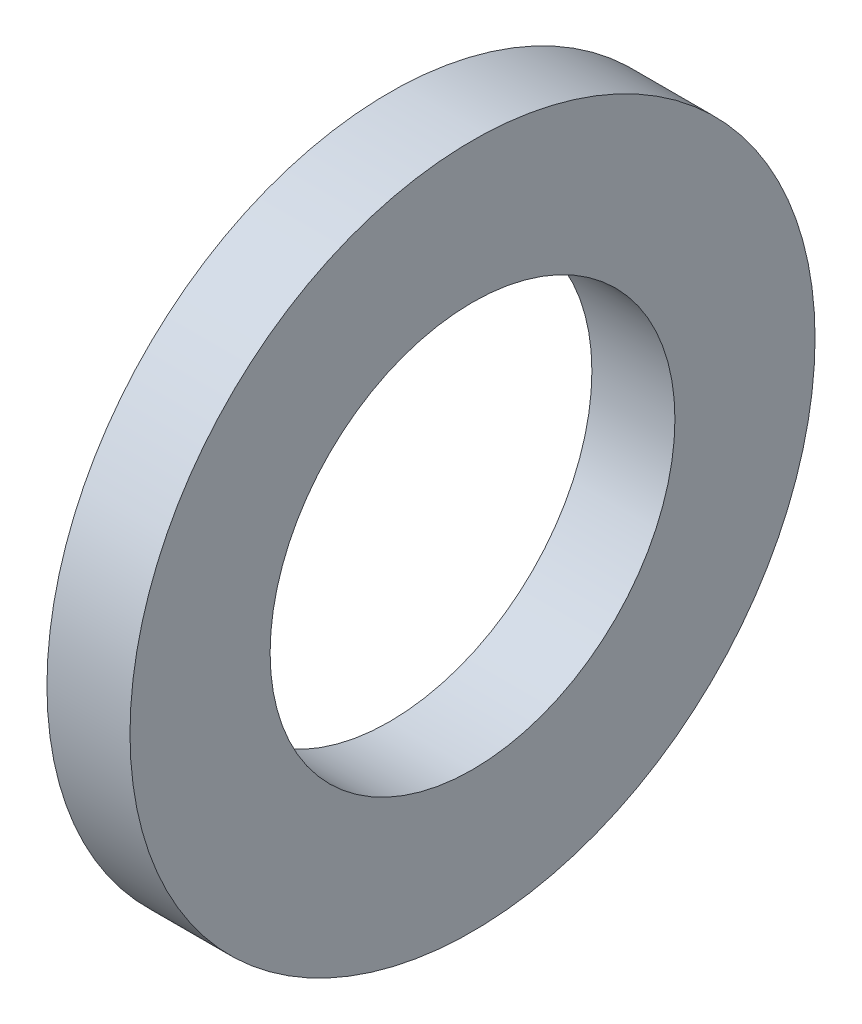
ISO-10303-21;
HEADER;
FILE_DESCRIPTION(('STEP AP214'),'2;1');
FILE_NAME('part.step','',(''),(''),'','','');
FILE_SCHEMA(('AUTOMOTIVE_DESIGN { 1 0 10303 214 1 1 1 1 }'));
ENDSEC;
DATA;
#1=APPLICATION_CONTEXT('core data for automotive mechanical design processes');
#2=APPLICATION_PROTOCOL_DEFINITION('international standard','automotive_design',2000,#1);
#3=PRODUCT_CONTEXT('',#1,'mechanical');
#4=PRODUCT('Part','Part','',(#3));
#5=PRODUCT_RELATED_PRODUCT_CATEGORY('part','',(#4));
#6=PRODUCT_DEFINITION_FORMATION('','',#4);
#7=PRODUCT_DEFINITION_CONTEXT('part definition',#1,'design');
#8=PRODUCT_DEFINITION('design','',#6,#7);
#9=PRODUCT_DEFINITION_SHAPE('','',#8);
#10=(LENGTH_UNIT() NAMED_UNIT(*) SI_UNIT(.MILLI.,.METRE.));
#11=(NAMED_UNIT(*) PLANE_ANGLE_UNIT() SI_UNIT($,.RADIAN.));
#12=(NAMED_UNIT(*) SI_UNIT($,.STERADIAN.) SOLID_ANGLE_UNIT());
#13=UNCERTAINTY_MEASURE_WITH_UNIT(LENGTH_MEASURE(1.E-05),#10,'distance_accuracy_value','');
#14=(GEOMETRIC_REPRESENTATION_CONTEXT(3) GLOBAL_UNCERTAINTY_ASSIGNED_CONTEXT((#13)) GLOBAL_UNIT_ASSIGNED_CONTEXT((#10,
#11,#12)) REPRESENTATION_CONTEXT('',''));
#15=CARTESIAN_POINT('',(0.,0.,0.));
#16=DIRECTION('',(0.,0.,1.));
#17=DIRECTION('',(1.,0.,0.));
#18=AXIS2_PLACEMENT_3D('',#15,#16,#17);
#19=CARTESIAN_POINT('',(8.,0.,0.));
#20=DIRECTION('',(1.,0.,0.));
#21=DIRECTION('',(0.,0.,-1.));
#22=AXIS2_PLACEMENT_3D('',#19,#20,#21);
#23=PLANE('',#22);
#24=CARTESIAN_POINT('',(8.,0.,0.));
#25=DIRECTION('',(1.,0.,0.));
#26=DIRECTION('',(0.,0.,-1.));
#27=AXIS2_PLACEMENT_3D('',#24,#25,#26);
#28=CIRCLE('',#27,33.);
#29=CARTESIAN_POINT('',(8.,0.,-33.));
#30=VERTEX_POINT('',#29);
#31=EDGE_CURVE('E10',#30,#30,#28,.T.);
#32=ORIENTED_EDGE('',*,*,#31,.T.);
#33=EDGE_LOOP('',(#32));
#34=FACE_BOUND('',#33,.T.);
#35=CARTESIAN_POINT('',(8.,0.,0.));
#36=DIRECTION('',(1.,0.,0.));
#37=DIRECTION('',(0.,0.,-1.));
#38=AXIS2_PLACEMENT_3D('',#35,#36,#37);
#39=CIRCLE('',#38,19.5);
#40=CARTESIAN_POINT('',(8.,0.,-19.5));
#41=VERTEX_POINT('',#40);
#42=EDGE_CURVE('E41',#41,#41,#39,.T.);
#43=ORIENTED_EDGE('',*,*,#42,.F.);
#44=EDGE_LOOP('',(#43));
#45=FACE_BOUND('',#44,.T.);
#46=ADVANCED_FACE('F30',(#34,#45),#23,.T.);
#47=CARTESIAN_POINT('',(0.,0.,0.));
#48=DIRECTION('',(1.,0.,0.));
#49=DIRECTION('',(0.,0.,-1.));
#50=AXIS2_PLACEMENT_3D('',#47,#48,#49);
#51=PLANE('',#50);
#52=CARTESIAN_POINT('',(0.,0.,0.));
#53=DIRECTION('',(1.,0.,0.));
#54=DIRECTION('',(0.,0.,-1.));
#55=AXIS2_PLACEMENT_3D('',#52,#53,#54);
#56=CIRCLE('',#55,33.);
#57=CARTESIAN_POINT('',(0.,0.,-33.));
#58=VERTEX_POINT('',#57);
#59=EDGE_CURVE('E34',#58,#58,#56,.T.);
#60=ORIENTED_EDGE('',*,*,#59,.F.);
#61=EDGE_LOOP('',(#60));
#62=FACE_BOUND('',#61,.T.);
#63=CARTESIAN_POINT('',(0.,0.,0.));
#64=DIRECTION('',(1.,0.,0.));
#65=DIRECTION('',(0.,0.,-1.));
#66=AXIS2_PLACEMENT_3D('',#63,#64,#65);
#67=CIRCLE('',#66,19.5);
#68=CARTESIAN_POINT('',(0.,0.,-19.5));
#69=VERTEX_POINT('',#68);
#70=EDGE_CURVE('E43',#69,#69,#67,.T.);
#71=ORIENTED_EDGE('',*,*,#70,.T.);
#72=EDGE_LOOP('',(#71));
#73=FACE_BOUND('',#72,.T.);
#74=ADVANCED_FACE('F53',(#62,#73),#51,.F.);
#75=CARTESIAN_POINT('',(8.,0.,0.));
#76=DIRECTION('',(-1.,0.,0.));
#77=DIRECTION('',(0.,0.,1.));
#78=AXIS2_PLACEMENT_3D('',#75,#76,#77);
#79=CYLINDRICAL_SURFACE('',#78,33.);
#80=ORIENTED_EDGE('',*,*,#31,.F.);
#81=EDGE_LOOP('',(#80));
#82=FACE_BOUND('',#81,.T.);
#83=ORIENTED_EDGE('',*,*,#59,.T.);
#84=EDGE_LOOP('',(#83));
#85=FACE_BOUND('',#84,.T.);
#86=ADVANCED_FACE('F32',(#82,#85),#79,.T.);
#87=CARTESIAN_POINT('',(8.,0.,0.));
#88=DIRECTION('',(-1.,0.,0.));
#89=DIRECTION('',(0.,0.,1.));
#90=AXIS2_PLACEMENT_3D('',#87,#88,#89);
#91=CYLINDRICAL_SURFACE('',#90,19.5);
#92=ORIENTED_EDGE('',*,*,#42,.T.);
#93=EDGE_LOOP('',(#92));
#94=FACE_BOUND('',#93,.T.);
#95=ORIENTED_EDGE('',*,*,#70,.F.);
#96=EDGE_LOOP('',(#95));
#97=FACE_BOUND('',#96,.T.);
#98=ADVANCED_FACE('F49',(#94,#97),#91,.F.);
#99=CLOSED_SHELL('',(#46,#74,#86,#98));
#100=MANIFOLD_SOLID_BREP('B2',#99);
#101=ADVANCED_BREP_SHAPE_REPRESENTATION('',(#18,#100),#14);
#102=SHAPE_DEFINITION_REPRESENTATION(#9,#101);
ENDSEC;
END-ISO-10303-21;
